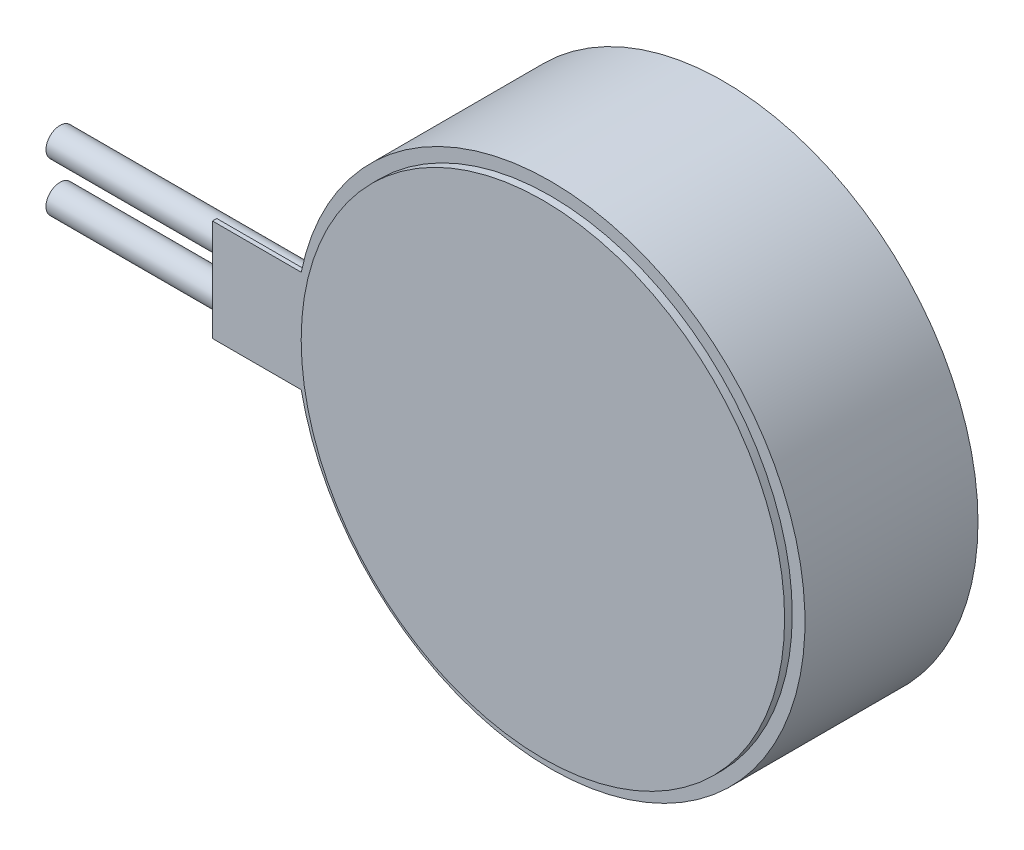
ISO-10303-21;
HEADER;
FILE_DESCRIPTION(('STEP AP214'),'2;1');
FILE_NAME('part.step','',(''),(''),'','','');
FILE_SCHEMA(('AUTOMOTIVE_DESIGN { 1 0 10303 214 1 1 1 1 }'));
ENDSEC;
DATA;
#1=APPLICATION_CONTEXT('core data for automotive mechanical design processes');
#2=APPLICATION_PROTOCOL_DEFINITION('international standard','automotive_design',2000,#1);
#3=PRODUCT_CONTEXT('',#1,'mechanical');
#4=PRODUCT('Part','Part','',(#3));
#5=PRODUCT_RELATED_PRODUCT_CATEGORY('part','',(#4));
#6=PRODUCT_DEFINITION_FORMATION('','',#4);
#7=PRODUCT_DEFINITION_CONTEXT('part definition',#1,'design');
#8=PRODUCT_DEFINITION('design','',#6,#7);
#9=PRODUCT_DEFINITION_SHAPE('','',#8);
#10=(LENGTH_UNIT() NAMED_UNIT(*) SI_UNIT(.MILLI.,.METRE.));
#11=(NAMED_UNIT(*) PLANE_ANGLE_UNIT() SI_UNIT($,.RADIAN.));
#12=(NAMED_UNIT(*) SI_UNIT($,.STERADIAN.) SOLID_ANGLE_UNIT());
#13=UNCERTAINTY_MEASURE_WITH_UNIT(LENGTH_MEASURE(1.E-05),#10,'distance_accuracy_value','');
#14=(GEOMETRIC_REPRESENTATION_CONTEXT(3) GLOBAL_UNCERTAINTY_ASSIGNED_CONTEXT((#13)) GLOBAL_UNIT_ASSIGNED_CONTEXT((#10,
#11,#12)) REPRESENTATION_CONTEXT('',''));
#15=CARTESIAN_POINT('',(0.,0.,0.));
#16=DIRECTION('',(0.,0.,1.));
#17=DIRECTION('',(1.,0.,0.));
#18=AXIS2_PLACEMENT_3D('',#15,#16,#17);
#19=CARTESIAN_POINT('',(-10.,0.493364025366365,3.04));
#20=DIRECTION('',(1.,0.,0.));
#21=DIRECTION('',(0.,0.,-1.));
#22=AXIS2_PLACEMENT_3D('',#19,#20,#21);
#23=CYLINDRICAL_SURFACE('',#22,0.275);
#24=CARTESIAN_POINT('',(-10.,0.493364025366365,3.04));
#25=DIRECTION('',(1.,0.,0.));
#26=DIRECTION('',(0.,0.,-1.));
#27=AXIS2_PLACEMENT_3D('',#24,#25,#26);
#28=CIRCLE('',#27,0.275);
#29=CARTESIAN_POINT('',(-10.,0.493364025366365,2.765));
#30=VERTEX_POINT('',#29);
#31=EDGE_CURVE('E44',#30,#30,#28,.T.);
#32=ORIENTED_EDGE('',*,*,#31,.T.);
#33=EDGE_LOOP('',(#32));
#34=FACE_BOUND('',#33,.T.);
#35=CARTESIAN_POINT('',(0.,0.493364025366365,3.04));
#36=DIRECTION('',(1.,0.,0.));
#37=DIRECTION('',(0.,0.,-1.));
#38=AXIS2_PLACEMENT_3D('',#35,#36,#37);
#39=CIRCLE('',#38,0.275);
#40=CARTESIAN_POINT('',(0.,0.493364025366365,2.765));
#41=VERTEX_POINT('',#40);
#42=EDGE_CURVE('E11',#41,#41,#39,.T.);
#43=ORIENTED_EDGE('',*,*,#42,.F.);
#44=EDGE_LOOP('',(#43));
#45=FACE_BOUND('',#44,.T.);
#46=ADVANCED_FACE('F40',(#34,#45),#23,.T.);
#47=CARTESIAN_POINT('',(-10.,0.493364025366365,3.04));
#48=DIRECTION('',(1.,0.,0.));
#49=DIRECTION('',(0.,0.,-1.));
#50=AXIS2_PLACEMENT_3D('',#47,#48,#49);
#51=PLANE('',#50);
#52=ORIENTED_EDGE('',*,*,#31,.F.);
#53=EDGE_LOOP('',(#52));
#54=FACE_BOUND('',#53,.T.);
#55=ADVANCED_FACE('F42',(#54),#51,.F.);
#56=CARTESIAN_POINT('',(0.,0.493364025366365,3.04));
#57=DIRECTION('',(1.,0.,0.));
#58=DIRECTION('',(0.,0.,-1.));
#59=AXIS2_PLACEMENT_3D('',#56,#57,#58);
#60=PLANE('',#59);
#61=ORIENTED_EDGE('',*,*,#42,.T.);
#62=EDGE_LOOP('',(#61));
#63=FACE_BOUND('',#62,.T.);
#64=ADVANCED_FACE('F56',(#63),#60,.T.);
#65=CLOSED_SHELL('',(#46,#55,#64));
#66=MANIFOLD_SOLID_BREP('B2',#65);
#67=CARTESIAN_POINT('',(-10.,-0.47511864699486,3.04));
#68=DIRECTION('',(1.,0.,0.));
#69=DIRECTION('',(0.,0.,-1.));
#70=AXIS2_PLACEMENT_3D('',#67,#68,#69);
#71=CYLINDRICAL_SURFACE('',#70,0.275);
#72=CARTESIAN_POINT('',(-10.,-0.47511864699486,3.04));
#73=DIRECTION('',(1.,0.,0.));
#74=DIRECTION('',(0.,0.,-1.));
#75=AXIS2_PLACEMENT_3D('',#72,#73,#74);
#76=CIRCLE('',#75,0.275);
#77=CARTESIAN_POINT('',(-10.,-0.47511864699486,2.765));
#78=VERTEX_POINT('',#77);
#79=EDGE_CURVE('E39',#78,#78,#76,.T.);
#80=ORIENTED_EDGE('',*,*,#79,.T.);
#81=EDGE_LOOP('',(#80));
#82=FACE_BOUND('',#81,.T.);
#83=CARTESIAN_POINT('',(0.,-0.47511864699486,3.04));
#84=DIRECTION('',(1.,0.,0.));
#85=DIRECTION('',(0.,0.,-1.));
#86=AXIS2_PLACEMENT_3D('',#83,#84,#85);
#87=CIRCLE('',#86,0.275);
#88=CARTESIAN_POINT('',(0.,-0.47511864699486,2.765));
#89=VERTEX_POINT('',#88);
#90=EDGE_CURVE('E93',#89,#89,#87,.T.);
#91=ORIENTED_EDGE('',*,*,#90,.F.);
#92=EDGE_LOOP('',(#91));
#93=FACE_BOUND('',#92,.T.);
#94=ADVANCED_FACE('F90',(#82,#93),#71,.T.);
#95=CARTESIAN_POINT('',(-10.,-0.47511864699486,3.04));
#96=DIRECTION('',(1.,0.,0.));
#97=DIRECTION('',(0.,0.,-1.));
#98=AXIS2_PLACEMENT_3D('',#95,#96,#97);
#99=PLANE('',#98);
#100=ORIENTED_EDGE('',*,*,#79,.F.);
#101=EDGE_LOOP('',(#100));
#102=FACE_BOUND('',#101,.T.);
#103=ADVANCED_FACE('F105',(#102),#99,.F.);
#104=CARTESIAN_POINT('',(0.,-0.47511864699486,3.04));
#105=DIRECTION('',(1.,0.,0.));
#106=DIRECTION('',(0.,0.,-1.));
#107=AXIS2_PLACEMENT_3D('',#104,#105,#106);
#108=PLANE('',#107);
#109=ORIENTED_EDGE('',*,*,#90,.T.);
#110=EDGE_LOOP('',(#109));
#111=FACE_BOUND('',#110,.T.);
#112=ADVANCED_FACE('F102',(#111),#108,.T.);
#113=CLOSED_SHELL('',(#94,#103,#112));
#114=MANIFOLD_SOLID_BREP('B6',#113);
#115=CARTESIAN_POINT('',(0.,0.,3.4));
#116=DIRECTION('',(0.,0.,1.));
#117=DIRECTION('',(1.,0.,0.));
#118=AXIS2_PLACEMENT_3D('',#115,#116,#117);
#119=PLANE('',#118);
#120=CARTESIAN_POINT('',(0.,0.,3.4));
#121=DIRECTION('',(0.,0.,1.));
#122=DIRECTION('',(1.,0.,0.));
#123=AXIS2_PLACEMENT_3D('',#120,#121,#122);
#124=CIRCLE('',#123,4.75);
#125=CARTESIAN_POINT('',(4.75,0.,3.4));
#126=VERTEX_POINT('',#125);
#127=EDGE_CURVE('E197',#126,#126,#124,.T.);
#128=ORIENTED_EDGE('',*,*,#127,.F.);
#129=EDGE_LOOP('',(#128));
#130=FACE_BOUND('',#129,.T.);
#131=DIRECTION('',(1.,0.,0.));
#132=VECTOR('',#131,1.);
#133=CARTESIAN_POINT('',(-4.64354390525168,-1.,3.4));
#134=LINE('',#133,#132);
#135=CARTESIAN_POINT('',(-6.64354390525168,-1.,3.4));
#136=VERTEX_POINT('',#135);
#137=CARTESIAN_POINT('',(-4.89897948556636,-1.,3.4));
#138=VERTEX_POINT('',#137);
#139=EDGE_CURVE('E145',#136,#138,#134,.T.);
#140=ORIENTED_EDGE('',*,*,#139,.T.);
#141=CARTESIAN_POINT('',(0.,0.,3.4));
#142=DIRECTION('',(0.,0.,1.));
#143=DIRECTION('',(1.,0.,0.));
#144=AXIS2_PLACEMENT_3D('',#141,#142,#143);
#145=CIRCLE('',#144,5.);
#146=CARTESIAN_POINT('',(-4.89897948556636,0.999999999999999,3.4));
#147=VERTEX_POINT('',#146);
#148=EDGE_CURVE('E205',#138,#147,#145,.T.);
#149=ORIENTED_EDGE('',*,*,#148,.T.);
#150=DIRECTION('',(-1.,0.,0.));
#151=VECTOR('',#150,1.);
#152=CARTESIAN_POINT('',(-4.64354390525168,0.999999999999999,3.4));
#153=LINE('',#152,#151);
#154=CARTESIAN_POINT('',(-6.64354390525168,0.999999999999999,3.4));
#155=VERTEX_POINT('',#154);
#156=EDGE_CURVE('E193',#147,#155,#153,.T.);
#157=ORIENTED_EDGE('',*,*,#156,.T.);
#158=DIRECTION('',(0.,-1.,0.));
#159=VECTOR('',#158,1.);
#160=CARTESIAN_POINT('',(-6.64354390525168,0.999999999999999,3.4));
#161=LINE('',#160,#159);
#162=EDGE_CURVE('E184',#155,#136,#161,.T.);
#163=ORIENTED_EDGE('',*,*,#162,.T.);
#164=EDGE_LOOP('',(#140,#149,#157,#163));
#165=FACE_BOUND('',#164,.T.);
#166=ADVANCED_FACE('F130',(#130,#165),#119,.T.);
#167=CARTESIAN_POINT('',(0.,0.,3.4));
#168=DIRECTION('',(0.,0.,-1.));
#169=DIRECTION('',(-1.,0.,0.));
#170=AXIS2_PLACEMENT_3D('',#167,#168,#169);
#171=CYLINDRICAL_SURFACE('',#170,5.);
#172=ORIENTED_EDGE('',*,*,#148,.F.);
#173=DIRECTION('',(0.,0.,-1.));
#174=VECTOR('',#173,1.);
#175=CARTESIAN_POINT('',(-4.89897948556636,-1.,3.4));
#176=LINE('',#175,#174);
#177=CARTESIAN_POINT('',(-4.89897948556636,-1.,3.315));
#178=VERTEX_POINT('',#177);
#179=EDGE_CURVE('E88',#138,#178,#176,.T.);
#180=ORIENTED_EDGE('',*,*,#179,.T.);
#181=CARTESIAN_POINT('',(0.,0.,3.315));
#182=DIRECTION('',(0.,0.,1.));
#183=DIRECTION('',(1.,0.,0.));
#184=AXIS2_PLACEMENT_3D('',#181,#182,#183);
#185=CIRCLE('',#184,5.);
#186=CARTESIAN_POINT('',(-4.89897948556636,0.999999999999999,3.315));
#187=VERTEX_POINT('',#186);
#188=EDGE_CURVE('E207',#187,#178,#185,.T.);
#189=ORIENTED_EDGE('',*,*,#188,.F.);
#190=DIRECTION('',(0.,0.,-1.));
#191=VECTOR('',#190,1.);
#192=CARTESIAN_POINT('',(-4.89897948556636,0.999999999999999,3.4));
#193=LINE('',#192,#191);
#194=EDGE_CURVE('E138',#187,#147,#193,.F.);
#195=ORIENTED_EDGE('',*,*,#194,.T.);
#196=EDGE_LOOP('',(#172,#180,#189,#195));
#197=FACE_BOUND('',#196,.T.);
#198=CARTESIAN_POINT('',(0.,0.,0.));
#199=DIRECTION('',(0.,0.,1.));
#200=DIRECTION('',(1.,0.,0.));
#201=AXIS2_PLACEMENT_3D('',#198,#199,#200);
#202=CIRCLE('',#201,5.);
#203=CARTESIAN_POINT('',(5.,0.,0.));
#204=VERTEX_POINT('',#203);
#205=EDGE_CURVE('E202',#204,#204,#202,.T.);
#206=ORIENTED_EDGE('',*,*,#205,.T.);
#207=EDGE_LOOP('',(#206));
#208=FACE_BOUND('',#207,.T.);
#209=ADVANCED_FACE('F132',(#197,#208),#171,.T.);
#210=CARTESIAN_POINT('',(0.,0.,0.));
#211=DIRECTION('',(0.,0.,1.));
#212=DIRECTION('',(1.,0.,0.));
#213=AXIS2_PLACEMENT_3D('',#210,#211,#212);
#214=PLANE('',#213);
#215=ORIENTED_EDGE('',*,*,#205,.F.);
#216=EDGE_LOOP('',(#215));
#217=FACE_BOUND('',#216,.T.);
#218=ADVANCED_FACE('F234',(#217),#214,.F.);
#219=CARTESIAN_POINT('',(0.,0.,3.55));
#220=DIRECTION('',(0.,0.,-1.));
#221=DIRECTION('',(-1.,0.,0.));
#222=AXIS2_PLACEMENT_3D('',#219,#220,#221);
#223=CYLINDRICAL_SURFACE('',#222,4.75);
#224=CARTESIAN_POINT('',(0.,0.,3.55));
#225=DIRECTION('',(0.,0.,1.));
#226=DIRECTION('',(1.,0.,0.));
#227=AXIS2_PLACEMENT_3D('',#224,#225,#226);
#228=CIRCLE('',#227,4.75);
#229=CARTESIAN_POINT('',(4.75,0.,3.55));
#230=VERTEX_POINT('',#229);
#231=EDGE_CURVE('E199',#230,#230,#228,.T.);
#232=ORIENTED_EDGE('',*,*,#231,.F.);
#233=EDGE_LOOP('',(#232));
#234=FACE_BOUND('',#233,.T.);
#235=ORIENTED_EDGE('',*,*,#127,.T.);
#236=EDGE_LOOP('',(#235));
#237=FACE_BOUND('',#236,.T.);
#238=ADVANCED_FACE('F223',(#234,#237),#223,.T.);
#239=CARTESIAN_POINT('',(0.,0.,3.55));
#240=DIRECTION('',(0.,0.,1.));
#241=DIRECTION('',(1.,0.,0.));
#242=AXIS2_PLACEMENT_3D('',#239,#240,#241);
#243=PLANE('',#242);
#244=ORIENTED_EDGE('',*,*,#231,.T.);
#245=EDGE_LOOP('',(#244));
#246=FACE_BOUND('',#245,.T.);
#247=ADVANCED_FACE('F216',(#246),#243,.T.);
#248=CARTESIAN_POINT('',(-4.64354390525168,-1.,3.315));
#249=DIRECTION('',(0.,-1.,0.));
#250=DIRECTION('',(1.,0.,0.));
#251=AXIS2_PLACEMENT_3D('',#248,#249,#250);
#252=PLANE('',#251);
#253=ORIENTED_EDGE('',*,*,#179,.F.);
#254=ORIENTED_EDGE('',*,*,#139,.F.);
#255=DIRECTION('',(0.,0.,1.));
#256=VECTOR('',#255,1.);
#257=CARTESIAN_POINT('',(-6.64354390525168,-1.,3.315));
#258=LINE('',#257,#256);
#259=CARTESIAN_POINT('',(-6.64354390525168,-1.,3.315));
#260=VERTEX_POINT('',#259);
#261=EDGE_CURVE('E185',#260,#136,#258,.T.);
#262=ORIENTED_EDGE('',*,*,#261,.F.);
#263=DIRECTION('',(1.,0.,0.));
#264=VECTOR('',#263,1.);
#265=CARTESIAN_POINT('',(-4.64354390525168,-1.,3.315));
#266=LINE('',#265,#264);
#267=EDGE_CURVE('E186',#260,#178,#266,.T.);
#268=ORIENTED_EDGE('',*,*,#267,.T.);
#269=EDGE_LOOP('',(#253,#254,#262,#268));
#270=FACE_BOUND('',#269,.T.);
#271=ADVANCED_FACE('F214',(#270),#252,.T.);
#272=CARTESIAN_POINT('',(-4.64354390525168,0.999999999999999,3.315));
#273=DIRECTION('',(0.,1.,0.));
#274=DIRECTION('',(-1.,0.,0.));
#275=AXIS2_PLACEMENT_3D('',#272,#273,#274);
#276=PLANE('',#275);
#277=ORIENTED_EDGE('',*,*,#194,.F.);
#278=DIRECTION('',(-1.,0.,0.));
#279=VECTOR('',#278,1.);
#280=CARTESIAN_POINT('',(-4.64354390525168,0.999999999999999,3.315));
#281=LINE('',#280,#279);
#282=CARTESIAN_POINT('',(-6.64354390525168,0.999999999999999,3.315));
#283=VERTEX_POINT('',#282);
#284=EDGE_CURVE('E170',#187,#283,#281,.T.);
#285=ORIENTED_EDGE('',*,*,#284,.T.);
#286=DIRECTION('',(0.,0.,1.));
#287=VECTOR('',#286,1.);
#288=CARTESIAN_POINT('',(-6.64354390525168,0.999999999999999,3.315));
#289=LINE('',#288,#287);
#290=EDGE_CURVE('E173',#283,#155,#289,.T.);
#291=ORIENTED_EDGE('',*,*,#290,.T.);
#292=ORIENTED_EDGE('',*,*,#156,.F.);
#293=EDGE_LOOP('',(#277,#285,#291,#292));
#294=FACE_BOUND('',#293,.T.);
#295=ADVANCED_FACE('F172',(#294),#276,.T.);
#296=CARTESIAN_POINT('',(0.,0.,3.315));
#297=DIRECTION('',(0.,0.,1.));
#298=DIRECTION('',(1.,0.,0.));
#299=AXIS2_PLACEMENT_3D('',#296,#297,#298);
#300=PLANE('',#299);
#301=ORIENTED_EDGE('',*,*,#284,.F.);
#302=ORIENTED_EDGE('',*,*,#188,.T.);
#303=ORIENTED_EDGE('',*,*,#267,.F.);
#304=DIRECTION('',(0.,-1.,0.));
#305=VECTOR('',#304,1.);
#306=CARTESIAN_POINT('',(-6.64354390525168,0.999999999999999,3.315));
#307=LINE('',#306,#305);
#308=EDGE_CURVE('E178',#283,#260,#307,.T.);
#309=ORIENTED_EDGE('',*,*,#308,.F.);
#310=EDGE_LOOP('',(#301,#302,#303,#309));
#311=FACE_BOUND('',#310,.T.);
#312=ADVANCED_FACE('F188',(#311),#300,.F.);
#313=CARTESIAN_POINT('',(-6.64354390525168,0.999999999999999,3.315));
#314=DIRECTION('',(-1.,0.,0.));
#315=DIRECTION('',(0.,0.,1.));
#316=AXIS2_PLACEMENT_3D('',#313,#314,#315);
#317=PLANE('',#316);
#318=ORIENTED_EDGE('',*,*,#162,.F.);
#319=ORIENTED_EDGE('',*,*,#290,.F.);
#320=ORIENTED_EDGE('',*,*,#308,.T.);
#321=ORIENTED_EDGE('',*,*,#261,.T.);
#322=EDGE_LOOP('',(#318,#319,#320,#321));
#323=FACE_BOUND('',#322,.T.);
#324=ADVANCED_FACE('F182',(#323),#317,.T.);
#325=CLOSED_SHELL('',(#166,#209,#218,#238,#247,#271,#295,#312,#324));
#326=MANIFOLD_SOLID_BREP('B34',#325);
#327=ADVANCED_BREP_SHAPE_REPRESENTATION('',(#18,#66,#114,#326),#14);
#328=SHAPE_DEFINITION_REPRESENTATION(#9,#327);
ENDSEC;
END-ISO-10303-21;
